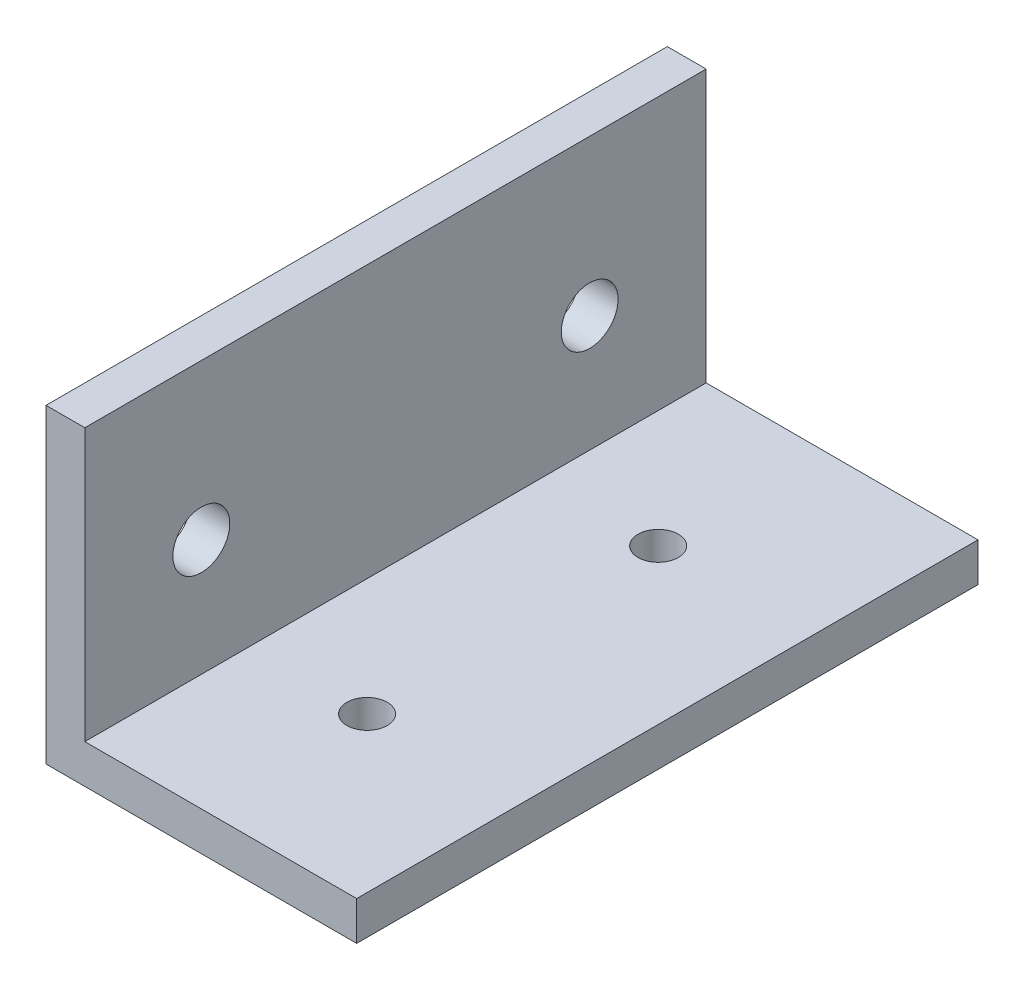
ISO-10303-21;
HEADER;
FILE_DESCRIPTION(('STEP AP214'),'2;1');
FILE_NAME('part.step','',(''),(''),'','','');
FILE_SCHEMA(('AUTOMOTIVE_DESIGN { 1 0 10303 214 1 1 1 1 }'));
ENDSEC;
DATA;
#1=APPLICATION_CONTEXT('core data for automotive mechanical design processes');
#2=APPLICATION_PROTOCOL_DEFINITION('international standard','automotive_design',2000,#1);
#3=PRODUCT_CONTEXT('',#1,'mechanical');
#4=PRODUCT('Part','Part','',(#3));
#5=PRODUCT_RELATED_PRODUCT_CATEGORY('part','',(#4));
#6=PRODUCT_DEFINITION_FORMATION('','',#4);
#7=PRODUCT_DEFINITION_CONTEXT('part definition',#1,'design');
#8=PRODUCT_DEFINITION('design','',#6,#7);
#9=PRODUCT_DEFINITION_SHAPE('','',#8);
#10=(LENGTH_UNIT() NAMED_UNIT(*) SI_UNIT(.MILLI.,.METRE.));
#11=(NAMED_UNIT(*) PLANE_ANGLE_UNIT() SI_UNIT($,.RADIAN.));
#12=(NAMED_UNIT(*) SI_UNIT($,.STERADIAN.) SOLID_ANGLE_UNIT());
#13=UNCERTAINTY_MEASURE_WITH_UNIT(LENGTH_MEASURE(1.E-05),#10,'distance_accuracy_value','');
#14=(GEOMETRIC_REPRESENTATION_CONTEXT(3) GLOBAL_UNCERTAINTY_ASSIGNED_CONTEXT((#13)) GLOBAL_UNIT_ASSIGNED_CONTEXT((#10,
#11,#12)) REPRESENTATION_CONTEXT('',''));
#15=CARTESIAN_POINT('',(0.,0.,0.));
#16=DIRECTION('',(0.,0.,1.));
#17=DIRECTION('',(1.,0.,0.));
#18=AXIS2_PLACEMENT_3D('',#15,#16,#17);
#19=CARTESIAN_POINT('',(0.,25.4,50.8));
#20=DIRECTION('',(0.,-1.,0.));
#21=DIRECTION('',(0.,0.,-1.));
#22=AXIS2_PLACEMENT_3D('',#19,#20,#21);
#23=PLANE('',#22);
#24=DIRECTION('',(-1.,0.,0.));
#25=VECTOR('',#24,1.);
#26=CARTESIAN_POINT('',(0.,25.4,0.));
#27=LINE('',#26,#25);
#28=CARTESIAN_POINT('',(3.175,25.4,0.));
#29=VERTEX_POINT('',#28);
#30=CARTESIAN_POINT('',(0.,25.4,0.));
#31=VERTEX_POINT('',#30);
#32=EDGE_CURVE('E122',#29,#31,#27,.T.);
#33=ORIENTED_EDGE('',*,*,#32,.T.);
#34=DIRECTION('',(0.,0.,-1.));
#35=VECTOR('',#34,1.);
#36=CARTESIAN_POINT('',(0.,25.4,50.8));
#37=LINE('',#36,#35);
#38=CARTESIAN_POINT('',(0.,25.4,50.8));
#39=VERTEX_POINT('',#38);
#40=EDGE_CURVE('E11',#39,#31,#37,.T.);
#41=ORIENTED_EDGE('',*,*,#40,.F.);
#42=DIRECTION('',(-1.,0.,0.));
#43=VECTOR('',#42,1.);
#44=CARTESIAN_POINT('',(0.,25.4,50.8));
#45=LINE('',#44,#43);
#46=CARTESIAN_POINT('',(3.175,25.4,50.8));
#47=VERTEX_POINT('',#46);
#48=EDGE_CURVE('E133',#47,#39,#45,.T.);
#49=ORIENTED_EDGE('',*,*,#48,.F.);
#50=DIRECTION('',(0.,0.,-1.));
#51=VECTOR('',#50,1.);
#52=CARTESIAN_POINT('',(3.175,25.4,50.8));
#53=LINE('',#52,#51);
#54=EDGE_CURVE('E118',#47,#29,#53,.T.);
#55=ORIENTED_EDGE('',*,*,#54,.T.);
#56=EDGE_LOOP('',(#33,#41,#49,#55));
#57=FACE_BOUND('',#56,.T.);
#58=ADVANCED_FACE('F36',(#57),#23,.F.);
#59=CARTESIAN_POINT('',(0.,25.4,50.8));
#60=DIRECTION('',(1.,0.,0.));
#61=DIRECTION('',(0.,0.,-1.));
#62=AXIS2_PLACEMENT_3D('',#59,#60,#61);
#63=PLANE('',#62);
#64=CARTESIAN_POINT('',(0.,12.7,9.525));
#65=DIRECTION('',(-1.,0.,0.));
#66=DIRECTION('',(0.,0.,1.));
#67=AXIS2_PLACEMENT_3D('',#64,#65,#66);
#68=CIRCLE('',#67,2.3241);
#69=CARTESIAN_POINT('',(0.,12.7,11.8491));
#70=VERTEX_POINT('',#69);
#71=EDGE_CURVE('E140',#70,#70,#68,.T.);
#72=ORIENTED_EDGE('',*,*,#71,.F.);
#73=EDGE_LOOP('',(#72));
#74=FACE_BOUND('',#73,.T.);
#75=CARTESIAN_POINT('',(0.,12.7,41.275));
#76=DIRECTION('',(-1.,0.,0.));
#77=DIRECTION('',(0.,0.,1.));
#78=AXIS2_PLACEMENT_3D('',#75,#76,#77);
#79=CIRCLE('',#78,2.32410000000001);
#80=CARTESIAN_POINT('',(0.,12.7,43.5991));
#81=VERTEX_POINT('',#80);
#82=EDGE_CURVE('E146',#81,#81,#79,.T.);
#83=ORIENTED_EDGE('',*,*,#82,.F.);
#84=EDGE_LOOP('',(#83));
#85=FACE_BOUND('',#84,.T.);
#86=DIRECTION('',(0.,-1.,0.));
#87=VECTOR('',#86,1.);
#88=CARTESIAN_POINT('',(0.,25.4,0.));
#89=LINE('',#88,#87);
#90=CARTESIAN_POINT('',(0.,0.,0.));
#91=VERTEX_POINT('',#90);
#92=EDGE_CURVE('E125',#31,#91,#89,.T.);
#93=ORIENTED_EDGE('',*,*,#92,.T.);
#94=DIRECTION('',(0.,0.,-1.));
#95=VECTOR('',#94,1.);
#96=CARTESIAN_POINT('',(0.,0.,50.8));
#97=LINE('',#96,#95);
#98=CARTESIAN_POINT('',(0.,0.,50.8));
#99=VERTEX_POINT('',#98);
#100=EDGE_CURVE('E45',#99,#91,#97,.T.);
#101=ORIENTED_EDGE('',*,*,#100,.F.);
#102=DIRECTION('',(0.,-1.,0.));
#103=VECTOR('',#102,1.);
#104=CARTESIAN_POINT('',(0.,25.4,50.8));
#105=LINE('',#104,#103);
#106=EDGE_CURVE('E91',#39,#99,#105,.T.);
#107=ORIENTED_EDGE('',*,*,#106,.F.);
#108=ORIENTED_EDGE('',*,*,#40,.T.);
#109=EDGE_LOOP('',(#93,#101,#107,#108));
#110=FACE_BOUND('',#109,.T.);
#111=ADVANCED_FACE('F166',(#74,#85,#110),#63,.F.);
#112=CARTESIAN_POINT('',(0.,0.,50.8));
#113=DIRECTION('',(0.,1.,0.));
#114=DIRECTION('',(0.,0.,1.));
#115=AXIS2_PLACEMENT_3D('',#112,#113,#114);
#116=PLANE('',#115);
#117=CARTESIAN_POINT('',(12.7500000000001,0.,13.499999988185));
#118=DIRECTION('',(0.,1.,0.));
#119=DIRECTION('',(0.,0.,1.));
#120=AXIS2_PLACEMENT_3D('',#117,#118,#119);
#121=CIRCLE('',#120,1.65);
#122=CARTESIAN_POINT('',(12.7500000000001,0.,15.149999988185));
#123=VERTEX_POINT('',#122);
#124=EDGE_CURVE('E126',#123,#123,#121,.T.);
#125=ORIENTED_EDGE('',*,*,#124,.T.);
#126=EDGE_LOOP('',(#125));
#127=FACE_BOUND('',#126,.T.);
#128=CARTESIAN_POINT('',(12.7500000000001,0.,37.299999988185));
#129=DIRECTION('',(0.,1.,0.));
#130=DIRECTION('',(0.,0.,1.));
#131=AXIS2_PLACEMENT_3D('',#128,#129,#130);
#132=CIRCLE('',#131,1.65);
#133=CARTESIAN_POINT('',(12.7500000000001,0.,38.949999988185));
#134=VERTEX_POINT('',#133);
#135=EDGE_CURVE('E158',#134,#134,#132,.T.);
#136=ORIENTED_EDGE('',*,*,#135,.T.);
#137=EDGE_LOOP('',(#136));
#138=FACE_BOUND('',#137,.T.);
#139=DIRECTION('',(1.,0.,0.));
#140=VECTOR('',#139,1.);
#141=CARTESIAN_POINT('',(0.,0.,0.));
#142=LINE('',#141,#140);
#143=CARTESIAN_POINT('',(25.4,0.,0.));
#144=VERTEX_POINT('',#143);
#145=EDGE_CURVE('E128',#91,#144,#142,.T.);
#146=ORIENTED_EDGE('',*,*,#145,.T.);
#147=DIRECTION('',(0.,0.,-1.));
#148=VECTOR('',#147,1.);
#149=CARTESIAN_POINT('',(25.4,0.,50.8));
#150=LINE('',#149,#148);
#151=CARTESIAN_POINT('',(25.4,0.,50.8));
#152=VERTEX_POINT('',#151);
#153=EDGE_CURVE('E113',#152,#144,#150,.T.);
#154=ORIENTED_EDGE('',*,*,#153,.F.);
#155=DIRECTION('',(1.,0.,0.));
#156=VECTOR('',#155,1.);
#157=CARTESIAN_POINT('',(0.,0.,50.8));
#158=LINE('',#157,#156);
#159=EDGE_CURVE('E104',#99,#152,#158,.T.);
#160=ORIENTED_EDGE('',*,*,#159,.F.);
#161=ORIENTED_EDGE('',*,*,#100,.T.);
#162=EDGE_LOOP('',(#146,#154,#160,#161));
#163=FACE_BOUND('',#162,.T.);
#164=ADVANCED_FACE('F169',(#127,#138,#163),#116,.F.);
#165=CARTESIAN_POINT('',(25.4,3.175,50.8));
#166=DIRECTION('',(-1.,0.,0.));
#167=DIRECTION('',(0.,0.,1.));
#168=AXIS2_PLACEMENT_3D('',#165,#166,#167);
#169=PLANE('',#168);
#170=DIRECTION('',(0.,1.,0.));
#171=VECTOR('',#170,1.);
#172=CARTESIAN_POINT('',(25.4,3.175,0.));
#173=LINE('',#172,#171);
#174=CARTESIAN_POINT('',(25.4,3.175,0.));
#175=VERTEX_POINT('',#174);
#176=EDGE_CURVE('E112',#144,#175,#173,.T.);
#177=ORIENTED_EDGE('',*,*,#176,.T.);
#178=DIRECTION('',(0.,0.,-1.));
#179=VECTOR('',#178,1.);
#180=CARTESIAN_POINT('',(25.4,3.175,50.8));
#181=LINE('',#180,#179);
#182=CARTESIAN_POINT('',(25.4,3.175,50.8));
#183=VERTEX_POINT('',#182);
#184=EDGE_CURVE('E109',#183,#175,#181,.T.);
#185=ORIENTED_EDGE('',*,*,#184,.F.);
#186=DIRECTION('',(0.,1.,0.));
#187=VECTOR('',#186,1.);
#188=CARTESIAN_POINT('',(25.4,3.175,50.8));
#189=LINE('',#188,#187);
#190=EDGE_CURVE('E98',#152,#183,#189,.T.);
#191=ORIENTED_EDGE('',*,*,#190,.F.);
#192=ORIENTED_EDGE('',*,*,#153,.T.);
#193=EDGE_LOOP('',(#177,#185,#191,#192));
#194=FACE_BOUND('',#193,.T.);
#195=ADVANCED_FACE('F110',(#194),#169,.F.);
#196=CARTESIAN_POINT('',(3.175,3.175,50.8));
#197=DIRECTION('',(0.,-1.,0.));
#198=DIRECTION('',(0.,0.,-1.));
#199=AXIS2_PLACEMENT_3D('',#196,#197,#198);
#200=PLANE('',#199);
#201=CARTESIAN_POINT('',(12.7500000000001,3.175,13.499999988185));
#202=DIRECTION('',(0.,1.,0.));
#203=DIRECTION('',(0.,0.,1.));
#204=AXIS2_PLACEMENT_3D('',#201,#202,#203);
#205=CIRCLE('',#204,1.65);
#206=CARTESIAN_POINT('',(12.7500000000001,3.175,15.149999988185));
#207=VERTEX_POINT('',#206);
#208=EDGE_CURVE('E155',#207,#207,#205,.T.);
#209=ORIENTED_EDGE('',*,*,#208,.F.);
#210=EDGE_LOOP('',(#209));
#211=FACE_BOUND('',#210,.T.);
#212=CARTESIAN_POINT('',(12.7500000000001,3.175,37.299999988185));
#213=DIRECTION('',(0.,1.,0.));
#214=DIRECTION('',(0.,0.,1.));
#215=AXIS2_PLACEMENT_3D('',#212,#213,#214);
#216=CIRCLE('',#215,1.65);
#217=CARTESIAN_POINT('',(12.7500000000001,3.175,38.949999988185));
#218=VERTEX_POINT('',#217);
#219=EDGE_CURVE('E144',#218,#218,#216,.T.);
#220=ORIENTED_EDGE('',*,*,#219,.F.);
#221=EDGE_LOOP('',(#220));
#222=FACE_BOUND('',#221,.T.);
#223=DIRECTION('',(-1.,0.,0.));
#224=VECTOR('',#223,1.);
#225=CARTESIAN_POINT('',(3.175,3.175,0.));
#226=LINE('',#225,#224);
#227=CARTESIAN_POINT('',(3.175,3.175,0.));
#228=VERTEX_POINT('',#227);
#229=EDGE_CURVE('E77',#175,#228,#226,.T.);
#230=ORIENTED_EDGE('',*,*,#229,.T.);
#231=DIRECTION('',(0.,0.,-1.));
#232=VECTOR('',#231,1.);
#233=CARTESIAN_POINT('',(3.175,3.175,50.8));
#234=LINE('',#233,#232);
#235=CARTESIAN_POINT('',(3.175,3.175,50.8));
#236=VERTEX_POINT('',#235);
#237=EDGE_CURVE('E114',#236,#228,#234,.T.);
#238=ORIENTED_EDGE('',*,*,#237,.F.);
#239=DIRECTION('',(-1.,0.,0.));
#240=VECTOR('',#239,1.);
#241=CARTESIAN_POINT('',(3.175,3.175,50.8));
#242=LINE('',#241,#240);
#243=EDGE_CURVE('E102',#183,#236,#242,.T.);
#244=ORIENTED_EDGE('',*,*,#243,.F.);
#245=ORIENTED_EDGE('',*,*,#184,.T.);
#246=EDGE_LOOP('',(#230,#238,#244,#245));
#247=FACE_BOUND('',#246,.T.);
#248=ADVANCED_FACE('F116',(#211,#222,#247),#200,.F.);
#249=CARTESIAN_POINT('',(3.175,25.4,50.8));
#250=DIRECTION('',(-1.,0.,0.));
#251=DIRECTION('',(0.,0.,1.));
#252=AXIS2_PLACEMENT_3D('',#249,#250,#251);
#253=PLANE('',#252);
#254=CARTESIAN_POINT('',(3.175,12.7,9.525));
#255=DIRECTION('',(-1.,0.,0.));
#256=DIRECTION('',(0.,0.,1.));
#257=AXIS2_PLACEMENT_3D('',#254,#255,#256);
#258=CIRCLE('',#257,2.3241);
#259=CARTESIAN_POINT('',(3.175,12.7,11.8491));
#260=VERTEX_POINT('',#259);
#261=EDGE_CURVE('E39',#260,#260,#258,.T.);
#262=ORIENTED_EDGE('',*,*,#261,.T.);
#263=EDGE_LOOP('',(#262));
#264=FACE_BOUND('',#263,.T.);
#265=CARTESIAN_POINT('',(3.175,12.7,41.275));
#266=DIRECTION('',(-1.,0.,0.));
#267=DIRECTION('',(0.,0.,1.));
#268=AXIS2_PLACEMENT_3D('',#265,#266,#267);
#269=CIRCLE('',#268,2.32410000000001);
#270=CARTESIAN_POINT('',(3.175,12.7,43.5991));
#271=VERTEX_POINT('',#270);
#272=EDGE_CURVE('E138',#271,#271,#269,.T.);
#273=ORIENTED_EDGE('',*,*,#272,.T.);
#274=EDGE_LOOP('',(#273));
#275=FACE_BOUND('',#274,.T.);
#276=DIRECTION('',(0.,1.,0.));
#277=VECTOR('',#276,1.);
#278=CARTESIAN_POINT('',(3.175,25.4,0.));
#279=LINE('',#278,#277);
#280=EDGE_CURVE('E83',#228,#29,#279,.T.);
#281=ORIENTED_EDGE('',*,*,#280,.T.);
#282=ORIENTED_EDGE('',*,*,#54,.F.);
#283=DIRECTION('',(0.,1.,0.));
#284=VECTOR('',#283,1.);
#285=CARTESIAN_POINT('',(3.175,25.4,50.8));
#286=LINE('',#285,#284);
#287=EDGE_CURVE('E54',#236,#47,#286,.T.);
#288=ORIENTED_EDGE('',*,*,#287,.F.);
#289=ORIENTED_EDGE('',*,*,#237,.T.);
#290=EDGE_LOOP('',(#281,#282,#288,#289));
#291=FACE_BOUND('',#290,.T.);
#292=ADVANCED_FACE('F174',(#264,#275,#291),#253,.F.);
#293=CARTESIAN_POINT('',(0.,0.,50.8));
#294=DIRECTION('',(0.,0.,-1.));
#295=DIRECTION('',(-1.,0.,0.));
#296=AXIS2_PLACEMENT_3D('',#293,#294,#295);
#297=PLANE('',#296);
#298=ORIENTED_EDGE('',*,*,#48,.T.);
#299=ORIENTED_EDGE('',*,*,#106,.T.);
#300=ORIENTED_EDGE('',*,*,#159,.T.);
#301=ORIENTED_EDGE('',*,*,#190,.T.);
#302=ORIENTED_EDGE('',*,*,#243,.T.);
#303=ORIENTED_EDGE('',*,*,#287,.T.);
#304=EDGE_LOOP('',(#298,#299,#300,#301,#302,#303));
#305=FACE_BOUND('',#304,.T.);
#306=ADVANCED_FACE('F100',(#305),#297,.F.);
#307=CARTESIAN_POINT('',(0.,0.,0.));
#308=DIRECTION('',(0.,0.,-1.));
#309=DIRECTION('',(-1.,0.,0.));
#310=AXIS2_PLACEMENT_3D('',#307,#308,#309);
#311=PLANE('',#310);
#312=ORIENTED_EDGE('',*,*,#32,.F.);
#313=ORIENTED_EDGE('',*,*,#280,.F.);
#314=ORIENTED_EDGE('',*,*,#229,.F.);
#315=ORIENTED_EDGE('',*,*,#176,.F.);
#316=ORIENTED_EDGE('',*,*,#145,.F.);
#317=ORIENTED_EDGE('',*,*,#92,.F.);
#318=EDGE_LOOP('',(#312,#313,#314,#315,#316,#317));
#319=FACE_BOUND('',#318,.T.);
#320=ADVANCED_FACE('F172',(#319),#311,.T.);
#321=CARTESIAN_POINT('',(12.7500000000001,0.,37.299999988185));
#322=DIRECTION('',(0.,1.,0.));
#323=DIRECTION('',(0.,0.,1.));
#324=AXIS2_PLACEMENT_3D('',#321,#322,#323);
#325=CYLINDRICAL_SURFACE('',#324,1.65);
#326=ORIENTED_EDGE('',*,*,#135,.F.);
#327=EDGE_LOOP('',(#326));
#328=FACE_BOUND('',#327,.T.);
#329=ORIENTED_EDGE('',*,*,#219,.T.);
#330=EDGE_LOOP('',(#329));
#331=FACE_BOUND('',#330,.T.);
#332=ADVANCED_FACE('F217',(#328,#331),#325,.F.);
#333=CARTESIAN_POINT('',(12.7500000000001,0.,13.499999988185));
#334=DIRECTION('',(0.,1.,0.));
#335=DIRECTION('',(0.,0.,1.));
#336=AXIS2_PLACEMENT_3D('',#333,#334,#335);
#337=CYLINDRICAL_SURFACE('',#336,1.65);
#338=ORIENTED_EDGE('',*,*,#124,.F.);
#339=EDGE_LOOP('',(#338));
#340=FACE_BOUND('',#339,.T.);
#341=ORIENTED_EDGE('',*,*,#208,.T.);
#342=EDGE_LOOP('',(#341));
#343=FACE_BOUND('',#342,.T.);
#344=ADVANCED_FACE('F222',(#340,#343),#337,.F.);
#345=CARTESIAN_POINT('',(25.4,12.7,41.275));
#346=DIRECTION('',(-1.,0.,0.));
#347=DIRECTION('',(0.,0.,1.));
#348=AXIS2_PLACEMENT_3D('',#345,#346,#347);
#349=CYLINDRICAL_SURFACE('',#348,2.32410000000001);
#350=ORIENTED_EDGE('',*,*,#82,.T.);
#351=EDGE_LOOP('',(#350));
#352=FACE_BOUND('',#351,.T.);
#353=ORIENTED_EDGE('',*,*,#272,.F.);
#354=EDGE_LOOP('',(#353));
#355=FACE_BOUND('',#354,.T.);
#356=ADVANCED_FACE('F233',(#352,#355),#349,.F.);
#357=CARTESIAN_POINT('',(25.4,12.7,9.525));
#358=DIRECTION('',(-1.,0.,0.));
#359=DIRECTION('',(0.,0.,1.));
#360=AXIS2_PLACEMENT_3D('',#357,#358,#359);
#361=CYLINDRICAL_SURFACE('',#360,2.3241);
#362=ORIENTED_EDGE('',*,*,#71,.T.);
#363=EDGE_LOOP('',(#362));
#364=FACE_BOUND('',#363,.T.);
#365=ORIENTED_EDGE('',*,*,#261,.F.);
#366=EDGE_LOOP('',(#365));
#367=FACE_BOUND('',#366,.T.);
#368=ADVANCED_FACE('F253',(#364,#367),#361,.F.);
#369=CLOSED_SHELL('',(#58,#111,#164,#195,#248,#292,#306,#320,#332,#344,#356,#368));
#370=MANIFOLD_SOLID_BREP('B2',#369);
#371=ADVANCED_BREP_SHAPE_REPRESENTATION('',(#18,#370),#14);
#372=SHAPE_DEFINITION_REPRESENTATION(#9,#371);
ENDSEC;
END-ISO-10303-21;
